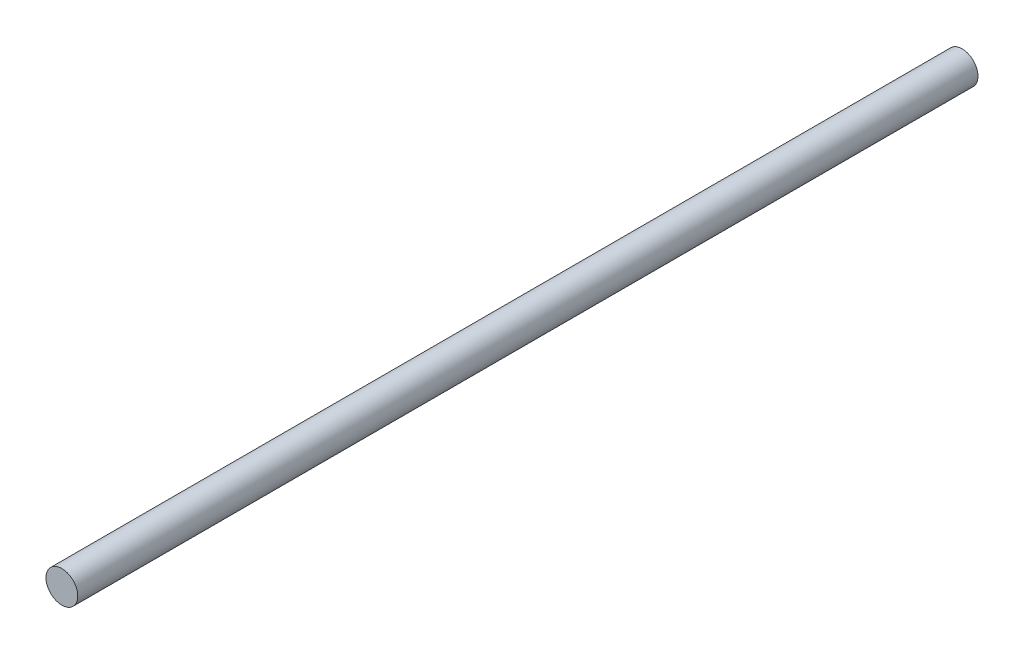
ISO-10303-21;
HEADER;
FILE_DESCRIPTION(('STEP AP214'),'2;1');
FILE_NAME('part.step','',(''),(''),'','','');
FILE_SCHEMA(('AUTOMOTIVE_DESIGN { 1 0 10303 214 1 1 1 1 }'));
ENDSEC;
DATA;
#1=APPLICATION_CONTEXT('core data for automotive mechanical design processes');
#2=APPLICATION_PROTOCOL_DEFINITION('international standard','automotive_design',2000,#1);
#3=PRODUCT_CONTEXT('',#1,'mechanical');
#4=PRODUCT('Part','Part','',(#3));
#5=PRODUCT_RELATED_PRODUCT_CATEGORY('part','',(#4));
#6=PRODUCT_DEFINITION_FORMATION('','',#4);
#7=PRODUCT_DEFINITION_CONTEXT('part definition',#1,'design');
#8=PRODUCT_DEFINITION('design','',#6,#7);
#9=PRODUCT_DEFINITION_SHAPE('','',#8);
#10=(LENGTH_UNIT() NAMED_UNIT(*) SI_UNIT(.MILLI.,.METRE.));
#11=(NAMED_UNIT(*) PLANE_ANGLE_UNIT() SI_UNIT($,.RADIAN.));
#12=(NAMED_UNIT(*) SI_UNIT($,.STERADIAN.) SOLID_ANGLE_UNIT());
#13=UNCERTAINTY_MEASURE_WITH_UNIT(LENGTH_MEASURE(1.E-05),#10,'distance_accuracy_value','');
#14=(GEOMETRIC_REPRESENTATION_CONTEXT(3) GLOBAL_UNCERTAINTY_ASSIGNED_CONTEXT((#13)) GLOBAL_UNIT_ASSIGNED_CONTEXT((#10,
#11,#12)) REPRESENTATION_CONTEXT('',''));
#15=CARTESIAN_POINT('',(0.,0.,0.));
#16=DIRECTION('',(0.,0.,1.));
#17=DIRECTION('',(1.,0.,0.));
#18=AXIS2_PLACEMENT_3D('',#15,#16,#17);
#19=CARTESIAN_POINT('',(0.,0.,170.));
#20=DIRECTION('',(0.,0.,-1.));
#21=DIRECTION('',(-1.,0.,0.));
#22=AXIS2_PLACEMENT_3D('',#19,#20,#21);
#23=CYLINDRICAL_SURFACE('',#22,3.);
#24=CARTESIAN_POINT('',(0.,0.,170.));
#25=DIRECTION('',(0.,0.,1.));
#26=DIRECTION('',(1.,0.,0.));
#27=AXIS2_PLACEMENT_3D('',#24,#25,#26);
#28=CIRCLE('',#27,3.);
#29=CARTESIAN_POINT('',(3.,0.,170.));
#30=VERTEX_POINT('',#29);
#31=EDGE_CURVE('E10',#30,#30,#28,.T.);
#32=ORIENTED_EDGE('',*,*,#31,.F.);
#33=EDGE_LOOP('',(#32));
#34=FACE_BOUND('',#33,.T.);
#35=CARTESIAN_POINT('',(0.,0.,0.));
#36=DIRECTION('',(0.,0.,1.));
#37=DIRECTION('',(1.,0.,0.));
#38=AXIS2_PLACEMENT_3D('',#35,#36,#37);
#39=CIRCLE('',#38,3.);
#40=CARTESIAN_POINT('',(3.,0.,0.));
#41=VERTEX_POINT('',#40);
#42=EDGE_CURVE('E34',#41,#41,#39,.T.);
#43=ORIENTED_EDGE('',*,*,#42,.T.);
#44=EDGE_LOOP('',(#43));
#45=FACE_BOUND('',#44,.T.);
#46=ADVANCED_FACE('F31',(#34,#45),#23,.T.);
#47=CARTESIAN_POINT('',(0.,0.,170.));
#48=DIRECTION('',(0.,0.,1.));
#49=DIRECTION('',(1.,0.,0.));
#50=AXIS2_PLACEMENT_3D('',#47,#48,#49);
#51=PLANE('',#50);
#52=ORIENTED_EDGE('',*,*,#31,.T.);
#53=EDGE_LOOP('',(#52));
#54=FACE_BOUND('',#53,.T.);
#55=ADVANCED_FACE('F46',(#54),#51,.T.);
#56=CARTESIAN_POINT('',(0.,0.,0.));
#57=DIRECTION('',(0.,0.,1.));
#58=DIRECTION('',(1.,0.,0.));
#59=AXIS2_PLACEMENT_3D('',#56,#57,#58);
#60=PLANE('',#59);
#61=ORIENTED_EDGE('',*,*,#42,.F.);
#62=EDGE_LOOP('',(#61));
#63=FACE_BOUND('',#62,.T.);
#64=ADVANCED_FACE('F44',(#63),#60,.F.);
#65=CLOSED_SHELL('',(#46,#55,#64));
#66=MANIFOLD_SOLID_BREP('B2',#65);
#67=ADVANCED_BREP_SHAPE_REPRESENTATION('',(#18,#66),#14);
#68=SHAPE_DEFINITION_REPRESENTATION(#9,#67);
ENDSEC;
END-ISO-10303-21;
